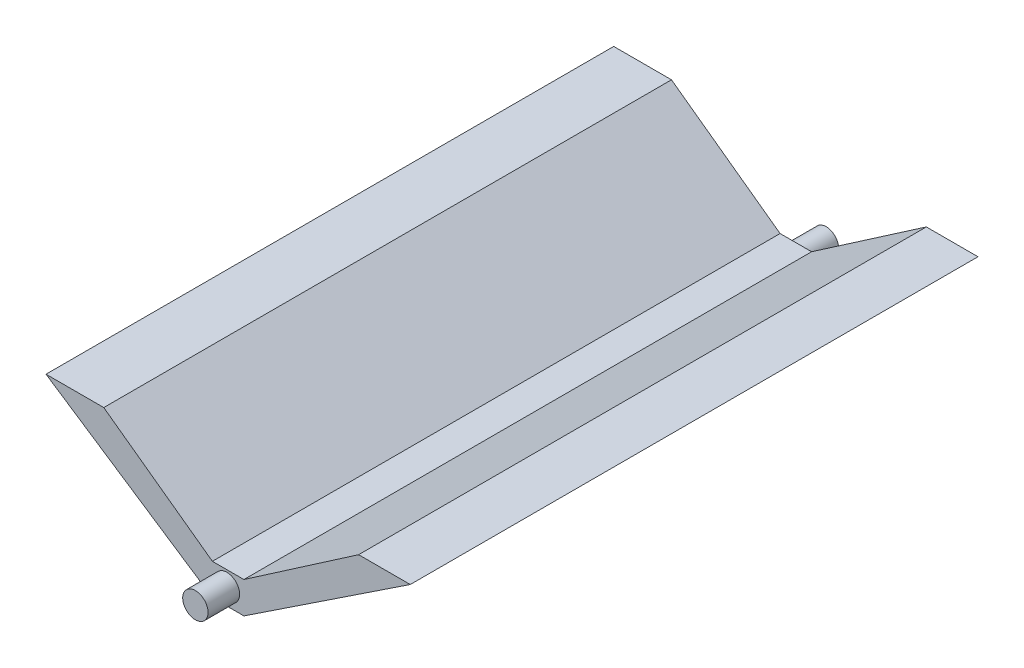
ISO-10303-21;
HEADER;
FILE_DESCRIPTION(('STEP AP214'),'2;1');
FILE_NAME('part.step','',(''),(''),'','','');
FILE_SCHEMA(('AUTOMOTIVE_DESIGN { 1 0 10303 214 1 1 1 1 }'));
ENDSEC;
DATA;
#1=APPLICATION_CONTEXT('core data for automotive mechanical design processes');
#2=APPLICATION_PROTOCOL_DEFINITION('international standard','automotive_design',2000,#1);
#3=PRODUCT_CONTEXT('',#1,'mechanical');
#4=PRODUCT('Part','Part','',(#3));
#5=PRODUCT_RELATED_PRODUCT_CATEGORY('part','',(#4));
#6=PRODUCT_DEFINITION_FORMATION('','',#4);
#7=PRODUCT_DEFINITION_CONTEXT('part definition',#1,'design');
#8=PRODUCT_DEFINITION('design','',#6,#7);
#9=PRODUCT_DEFINITION_SHAPE('','',#8);
#10=(LENGTH_UNIT() NAMED_UNIT(*) SI_UNIT(.MILLI.,.METRE.));
#11=(NAMED_UNIT(*) PLANE_ANGLE_UNIT() SI_UNIT($,.RADIAN.));
#12=(NAMED_UNIT(*) SI_UNIT($,.STERADIAN.) SOLID_ANGLE_UNIT());
#13=UNCERTAINTY_MEASURE_WITH_UNIT(LENGTH_MEASURE(1.E-05),#10,'distance_accuracy_value','');
#14=(GEOMETRIC_REPRESENTATION_CONTEXT(3) GLOBAL_UNCERTAINTY_ASSIGNED_CONTEXT((#13)) GLOBAL_UNIT_ASSIGNED_CONTEXT((#10,
#11,#12)) REPRESENTATION_CONTEXT('',''));
#15=CARTESIAN_POINT('',(0.,0.,0.));
#16=DIRECTION('',(0.,0.,1.));
#17=DIRECTION('',(1.,0.,0.));
#18=AXIS2_PLACEMENT_3D('',#15,#16,#17);
#19=CARTESIAN_POINT('',(115.5,32.5935990338164,360.));
#20=DIRECTION('',(0.,-1.,0.));
#21=DIRECTION('',(0.,0.,-1.));
#22=AXIS2_PLACEMENT_3D('',#19,#20,#21);
#23=PLANE('',#22);
#24=DIRECTION('',(-1.,0.,0.));
#25=VECTOR('',#24,1.);
#26=CARTESIAN_POINT('',(115.5,32.5935990338164,360.));
#27=LINE('',#26,#25);
#28=CARTESIAN_POINT('',(-78.8670896562479,32.5935990338164,360.));
#29=VERTEX_POINT('',#28);
#30=CARTESIAN_POINT('',(-115.5,32.5935990338164,360.));
#31=VERTEX_POINT('',#30);
#32=EDGE_CURVE('E88',#29,#31,#27,.T.);
#33=ORIENTED_EDGE('',*,*,#32,.F.);
#34=DIRECTION('',(0.,0.,1.));
#35=VECTOR('',#34,1.);
#36=CARTESIAN_POINT('',(-78.8670896562479,32.5935990338164,0.));
#37=LINE('',#36,#35);
#38=CARTESIAN_POINT('',(-78.8670896562479,32.5935990338164,0.));
#39=VERTEX_POINT('',#38);
#40=EDGE_CURVE('E143',#39,#29,#37,.T.);
#41=ORIENTED_EDGE('',*,*,#40,.F.);
#42=DIRECTION('',(-1.,0.,0.));
#43=VECTOR('',#42,1.);
#44=CARTESIAN_POINT('',(115.5,32.5935990338164,0.));
#45=LINE('',#44,#43);
#46=CARTESIAN_POINT('',(-115.5,32.5935990338164,0.));
#47=VERTEX_POINT('',#46);
#48=EDGE_CURVE('E130',#39,#47,#45,.T.);
#49=ORIENTED_EDGE('',*,*,#48,.T.);
#50=DIRECTION('',(0.,0.,-1.));
#51=VECTOR('',#50,1.);
#52=CARTESIAN_POINT('',(-115.5,32.5935990338164,360.));
#53=LINE('',#52,#51);
#54=EDGE_CURVE('E44',#31,#47,#53,.T.);
#55=ORIENTED_EDGE('',*,*,#54,.F.);
#56=EDGE_LOOP('',(#33,#41,#49,#55));
#57=FACE_BOUND('',#56,.T.);
#58=ADVANCED_FACE('F36',(#57),#23,.F.);
#59=CARTESIAN_POINT('',(115.5,32.5935990338164,0.));
#60=VERTEX_POINT('',#59);
#61=CARTESIAN_POINT('',(82.7331234629267,32.5935990338164,0.));
#62=VERTEX_POINT('',#61);
#63=EDGE_CURVE('E157',#60,#62,#45,.T.);
#64=ORIENTED_EDGE('',*,*,#63,.T.);
#65=DIRECTION('',(0.,0.,1.));
#66=VECTOR('',#65,1.);
#67=CARTESIAN_POINT('',(82.7331234629267,32.5935990338164,0.));
#68=LINE('',#67,#66);
#69=CARTESIAN_POINT('',(82.7331234629267,32.5935990338164,360.));
#70=VERTEX_POINT('',#69);
#71=EDGE_CURVE('E145',#62,#70,#68,.T.);
#72=ORIENTED_EDGE('',*,*,#71,.T.);
#73=CARTESIAN_POINT('',(115.5,32.5935990338164,360.));
#74=VERTEX_POINT('',#73);
#75=EDGE_CURVE('E149',#74,#70,#27,.T.);
#76=ORIENTED_EDGE('',*,*,#75,.F.);
#77=DIRECTION('',(0.,0.,-1.));
#78=VECTOR('',#77,1.);
#79=CARTESIAN_POINT('',(115.5,32.5935990338164,360.));
#80=LINE('',#79,#78);
#81=EDGE_CURVE('E156',#74,#60,#80,.T.);
#82=ORIENTED_EDGE('',*,*,#81,.T.);
#83=EDGE_LOOP('',(#64,#72,#76,#82));
#84=FACE_BOUND('',#83,.T.);
#85=ADVANCED_FACE('F38',(#84),#23,.F.);
#86=CARTESIAN_POINT('',(-115.5,32.5935990338164,360.));
#87=DIRECTION('',(0.552876196546105,0.833263410508773,0.));
#88=DIRECTION('',(-0.833263410508773,0.552876196546106,0.));
#89=AXIS2_PLACEMENT_3D('',#86,#87,#88);
#90=PLANE('',#89);
#91=DIRECTION('',(0.833263410508773,-0.552876196546106,0.));
#92=VECTOR('',#91,1.);
#93=CARTESIAN_POINT('',(-115.5,32.5935990338164,0.));
#94=LINE('',#93,#92);
#95=CARTESIAN_POINT('',(-10.,-37.4064009661836,0.));
#96=VERTEX_POINT('',#95);
#97=EDGE_CURVE('E160',#47,#96,#94,.T.);
#98=ORIENTED_EDGE('',*,*,#97,.T.);
#99=DIRECTION('',(0.,0.,-1.));
#100=VECTOR('',#99,1.);
#101=CARTESIAN_POINT('',(-10.,-37.4064009661836,360.));
#102=LINE('',#101,#100);
#103=CARTESIAN_POINT('',(-10.,-37.4064009661836,360.));
#104=VERTEX_POINT('',#103);
#105=EDGE_CURVE('E168',#104,#96,#102,.T.);
#106=ORIENTED_EDGE('',*,*,#105,.F.);
#107=DIRECTION('',(0.833263410508773,-0.552876196546106,0.));
#108=VECTOR('',#107,1.);
#109=CARTESIAN_POINT('',(-115.5,32.5935990338164,360.));
#110=LINE('',#109,#108);
#111=EDGE_CURVE('E151',#31,#104,#110,.T.);
#112=ORIENTED_EDGE('',*,*,#111,.F.);
#113=ORIENTED_EDGE('',*,*,#54,.T.);
#114=EDGE_LOOP('',(#98,#106,#112,#113));
#115=FACE_BOUND('',#114,.T.);
#116=ADVANCED_FACE('F173',(#115),#90,.F.);
#117=CARTESIAN_POINT('',(10.,-37.4064009661836,360.));
#118=DIRECTION('',(0.,1.,0.));
#119=DIRECTION('',(0.,0.,1.));
#120=AXIS2_PLACEMENT_3D('',#117,#118,#119);
#121=PLANE('',#120);
#122=DIRECTION('',(1.,0.,0.));
#123=VECTOR('',#122,1.);
#124=CARTESIAN_POINT('',(10.,-37.4064009661836,0.));
#125=LINE('',#124,#123);
#126=CARTESIAN_POINT('',(10.,-37.4064009661836,0.));
#127=VERTEX_POINT('',#126);
#128=EDGE_CURVE('E162',#96,#127,#125,.T.);
#129=ORIENTED_EDGE('',*,*,#128,.T.);
#130=DIRECTION('',(0.,0.,-1.));
#131=VECTOR('',#130,1.);
#132=CARTESIAN_POINT('',(10.,-37.4064009661836,360.));
#133=LINE('',#132,#131);
#134=CARTESIAN_POINT('',(10.,-37.4064009661836,360.));
#135=VERTEX_POINT('',#134);
#136=EDGE_CURVE('E166',#135,#127,#133,.T.);
#137=ORIENTED_EDGE('',*,*,#136,.F.);
#138=DIRECTION('',(1.,0.,0.));
#139=VECTOR('',#138,1.);
#140=CARTESIAN_POINT('',(10.,-37.4064009661836,360.));
#141=LINE('',#140,#139);
#142=EDGE_CURVE('E153',#104,#135,#141,.T.);
#143=ORIENTED_EDGE('',*,*,#142,.F.);
#144=ORIENTED_EDGE('',*,*,#105,.T.);
#145=EDGE_LOOP('',(#129,#137,#143,#144));
#146=FACE_BOUND('',#145,.T.);
#147=ADVANCED_FACE('F180',(#146),#121,.F.);
#148=CARTESIAN_POINT('',(10.,-37.4064009661836,360.));
#149=DIRECTION('',(-0.552876196546105,0.833263410508773,0.));
#150=DIRECTION('',(-0.833263410508773,-0.552876196546106,0.));
#151=AXIS2_PLACEMENT_3D('',#148,#149,#150);
#152=PLANE('',#151);
#153=DIRECTION('',(0.833263410508773,0.552876196546106,0.));
#154=VECTOR('',#153,1.);
#155=CARTESIAN_POINT('',(10.,-37.4064009661836,0.));
#156=LINE('',#155,#154);
#157=EDGE_CURVE('E81',#127,#60,#156,.T.);
#158=ORIENTED_EDGE('',*,*,#157,.T.);
#159=ORIENTED_EDGE('',*,*,#81,.F.);
#160=DIRECTION('',(0.833263410508773,0.552876196546106,0.));
#161=VECTOR('',#160,1.);
#162=CARTESIAN_POINT('',(10.,-37.4064009661836,360.));
#163=LINE('',#162,#161);
#164=EDGE_CURVE('E60',#135,#74,#163,.T.);
#165=ORIENTED_EDGE('',*,*,#164,.F.);
#166=ORIENTED_EDGE('',*,*,#136,.T.);
#167=EDGE_LOOP('',(#158,#159,#165,#166));
#168=FACE_BOUND('',#167,.T.);
#169=ADVANCED_FACE('F182',(#168),#152,.F.);
#170=CARTESIAN_POINT('',(0.,0.,360.));
#171=DIRECTION('',(0.,0.,1.));
#172=DIRECTION('',(1.,0.,0.));
#173=AXIS2_PLACEMENT_3D('',#170,#171,#172);
#174=PLANE('',#173);
#175=CARTESIAN_POINT('',(-0.773206761335771,-26.8912817418148,360.));
#176=DIRECTION('',(0.,0.,1.));
#177=DIRECTION('',(1.,0.,0.));
#178=AXIS2_PLACEMENT_3D('',#175,#176,#177);
#179=CIRCLE('',#178,8.05);
#180=CARTESIAN_POINT('',(7.27679323866423,-26.8912817418148,360.));
#181=VERTEX_POINT('',#180);
#182=EDGE_CURVE('E136',#181,#181,#179,.T.);
#183=ORIENTED_EDGE('',*,*,#182,.F.);
#184=EDGE_LOOP('',(#183));
#185=FACE_BOUND('',#184,.T.);
#186=DIRECTION('',(0.809211786942428,-0.587517049857655,0.));
#187=VECTOR('',#186,1.);
#188=CARTESIAN_POINT('',(-10.,-17.4064009661836,360.));
#189=LINE('',#188,#187);
#190=CARTESIAN_POINT('',(-10.,-17.4064009661836,360.));
#191=VERTEX_POINT('',#190);
#192=EDGE_CURVE('E116',#29,#191,#189,.T.);
#193=ORIENTED_EDGE('',*,*,#192,.F.);
#194=ORIENTED_EDGE('',*,*,#32,.T.);
#195=ORIENTED_EDGE('',*,*,#111,.T.);
#196=ORIENTED_EDGE('',*,*,#142,.T.);
#197=ORIENTED_EDGE('',*,*,#164,.T.);
#198=ORIENTED_EDGE('',*,*,#75,.T.);
#199=DIRECTION('',(0.824063199265385,0.566497876091781,0.));
#200=VECTOR('',#199,1.);
#201=CARTESIAN_POINT('',(10.,-17.4064009661836,360.));
#202=LINE('',#201,#200);
#203=CARTESIAN_POINT('',(10.,-17.4064009661836,360.));
#204=VERTEX_POINT('',#203);
#205=EDGE_CURVE('E131',#204,#70,#202,.T.);
#206=ORIENTED_EDGE('',*,*,#205,.F.);
#207=DIRECTION('',(1.,0.,0.));
#208=VECTOR('',#207,1.);
#209=CARTESIAN_POINT('',(-10.,-17.4064009661836,360.));
#210=LINE('',#209,#208);
#211=EDGE_CURVE('E133',#191,#204,#210,.T.);
#212=ORIENTED_EDGE('',*,*,#211,.F.);
#213=EDGE_LOOP('',(#193,#194,#195,#196,#197,#198,#206,#212));
#214=FACE_BOUND('',#213,.T.);
#215=ADVANCED_FACE('F186',(#185,#214),#174,.T.);
#216=CARTESIAN_POINT('',(0.,0.,0.));
#217=DIRECTION('',(0.,0.,1.));
#218=DIRECTION('',(1.,0.,0.));
#219=AXIS2_PLACEMENT_3D('',#216,#217,#218);
#220=PLANE('',#219);
#221=CARTESIAN_POINT('',(-0.773206761335771,-26.8912817418148,0.));
#222=DIRECTION('',(0.,0.,1.));
#223=DIRECTION('',(1.,0.,0.));
#224=AXIS2_PLACEMENT_3D('',#221,#222,#223);
#225=CIRCLE('',#224,7.87377693535657);
#226=CARTESIAN_POINT('',(7.10057017402079,-26.8912817418148,0.));
#227=VERTEX_POINT('',#226);
#228=EDGE_CURVE('E11',#227,#227,#225,.F.);
#229=ORIENTED_EDGE('',*,*,#228,.F.);
#230=EDGE_LOOP('',(#229));
#231=FACE_BOUND('',#230,.T.);
#232=ORIENTED_EDGE('',*,*,#48,.F.);
#233=DIRECTION('',(0.809211786942428,-0.587517049857655,0.));
#234=VECTOR('',#233,1.);
#235=CARTESIAN_POINT('',(-10.,-17.4064009661836,0.));
#236=LINE('',#235,#234);
#237=CARTESIAN_POINT('',(-10.,-17.4064009661836,0.));
#238=VERTEX_POINT('',#237);
#239=EDGE_CURVE('E114',#39,#238,#236,.T.);
#240=ORIENTED_EDGE('',*,*,#239,.T.);
#241=DIRECTION('',(1.,0.,0.));
#242=VECTOR('',#241,1.);
#243=CARTESIAN_POINT('',(-10.,-17.4064009661836,0.));
#244=LINE('',#243,#242);
#245=CARTESIAN_POINT('',(10.,-17.4064009661836,0.));
#246=VERTEX_POINT('',#245);
#247=EDGE_CURVE('E123',#238,#246,#244,.T.);
#248=ORIENTED_EDGE('',*,*,#247,.T.);
#249=DIRECTION('',(0.824063199265385,0.566497876091781,0.));
#250=VECTOR('',#249,1.);
#251=CARTESIAN_POINT('',(10.,-17.4064009661836,0.));
#252=LINE('',#251,#250);
#253=EDGE_CURVE('E51',#246,#62,#252,.T.);
#254=ORIENTED_EDGE('',*,*,#253,.T.);
#255=ORIENTED_EDGE('',*,*,#63,.F.);
#256=ORIENTED_EDGE('',*,*,#157,.F.);
#257=ORIENTED_EDGE('',*,*,#128,.F.);
#258=ORIENTED_EDGE('',*,*,#97,.F.);
#259=EDGE_LOOP('',(#232,#240,#248,#254,#255,#256,#257,#258));
#260=FACE_BOUND('',#259,.T.);
#261=ADVANCED_FACE('F128',(#231,#260),#220,.F.);
#262=CARTESIAN_POINT('',(-10.,-17.4064009661836,0.));
#263=DIRECTION('',(-0.587517049857655,-0.809211786942428,0.));
#264=DIRECTION('',(0.809211786942428,-0.587517049857655,0.));
#265=AXIS2_PLACEMENT_3D('',#262,#263,#264);
#266=PLANE('',#265);
#267=ORIENTED_EDGE('',*,*,#192,.T.);
#268=DIRECTION('',(0.,0.,1.));
#269=VECTOR('',#268,1.);
#270=CARTESIAN_POINT('',(-10.,-17.4064009661836,0.));
#271=LINE('',#270,#269);
#272=EDGE_CURVE('E110',#238,#191,#271,.T.);
#273=ORIENTED_EDGE('',*,*,#272,.F.);
#274=ORIENTED_EDGE('',*,*,#239,.F.);
#275=ORIENTED_EDGE('',*,*,#40,.T.);
#276=EDGE_LOOP('',(#267,#273,#274,#275));
#277=FACE_BOUND('',#276,.T.);
#278=ADVANCED_FACE('F112',(#277),#266,.F.);
#279=CARTESIAN_POINT('',(10.,-17.4064009661836,0.));
#280=DIRECTION('',(0.566497876091781,-0.824063199265385,0.));
#281=DIRECTION('',(0.824063199265385,0.566497876091781,0.));
#282=AXIS2_PLACEMENT_3D('',#279,#280,#281);
#283=PLANE('',#282);
#284=ORIENTED_EDGE('',*,*,#205,.T.);
#285=ORIENTED_EDGE('',*,*,#71,.F.);
#286=ORIENTED_EDGE('',*,*,#253,.F.);
#287=DIRECTION('',(0.,0.,1.));
#288=VECTOR('',#287,1.);
#289=CARTESIAN_POINT('',(10.,-17.4064009661836,0.));
#290=LINE('',#289,#288);
#291=EDGE_CURVE('E120',#246,#204,#290,.T.);
#292=ORIENTED_EDGE('',*,*,#291,.T.);
#293=EDGE_LOOP('',(#284,#285,#286,#292));
#294=FACE_BOUND('',#293,.T.);
#295=ADVANCED_FACE('F187',(#294),#283,.F.);
#296=CARTESIAN_POINT('',(-10.,-17.4064009661836,0.));
#297=DIRECTION('',(0.,-1.,0.));
#298=DIRECTION('',(0.,0.,-1.));
#299=AXIS2_PLACEMENT_3D('',#296,#297,#298);
#300=PLANE('',#299);
#301=ORIENTED_EDGE('',*,*,#211,.T.);
#302=ORIENTED_EDGE('',*,*,#291,.F.);
#303=ORIENTED_EDGE('',*,*,#247,.F.);
#304=ORIENTED_EDGE('',*,*,#272,.T.);
#305=EDGE_LOOP('',(#301,#302,#303,#304));
#306=FACE_BOUND('',#305,.T.);
#307=ADVANCED_FACE('F124',(#306),#300,.F.);
#308=CARTESIAN_POINT('',(-0.773206761335771,-26.8912817418148,380.));
#309=DIRECTION('',(0.,0.,-1.));
#310=DIRECTION('',(-1.,0.,0.));
#311=AXIS2_PLACEMENT_3D('',#308,#309,#310);
#312=CYLINDRICAL_SURFACE('',#311,8.05);
#313=CARTESIAN_POINT('',(-0.773206761335771,-26.8912817418148,380.));
#314=DIRECTION('',(0.,0.,1.));
#315=DIRECTION('',(1.,0.,0.));
#316=AXIS2_PLACEMENT_3D('',#313,#314,#315);
#317=CIRCLE('',#316,8.05);
#318=CARTESIAN_POINT('',(7.27679323866423,-26.8912817418148,380.));
#319=VERTEX_POINT('',#318);
#320=EDGE_CURVE('E141',#319,#319,#317,.T.);
#321=ORIENTED_EDGE('',*,*,#320,.F.);
#322=EDGE_LOOP('',(#321));
#323=FACE_BOUND('',#322,.T.);
#324=ORIENTED_EDGE('',*,*,#182,.T.);
#325=EDGE_LOOP('',(#324));
#326=FACE_BOUND('',#325,.T.);
#327=ADVANCED_FACE('F194',(#323,#326),#312,.T.);
#328=CARTESIAN_POINT('',(-0.773206761335771,-26.8912817418148,380.));
#329=DIRECTION('',(0.,0.,1.));
#330=DIRECTION('',(1.,0.,0.));
#331=AXIS2_PLACEMENT_3D('',#328,#329,#330);
#332=PLANE('',#331);
#333=ORIENTED_EDGE('',*,*,#320,.T.);
#334=EDGE_LOOP('',(#333));
#335=FACE_BOUND('',#334,.T.);
#336=ADVANCED_FACE('F233',(#335),#332,.T.);
#337=CARTESIAN_POINT('',(-0.773206761335771,-26.8912817418148,-20.));
#338=DIRECTION('',(0.,0.,1.));
#339=DIRECTION('',(1.,0.,0.));
#340=AXIS2_PLACEMENT_3D('',#337,#338,#339);
#341=CYLINDRICAL_SURFACE('',#340,7.87377693535657);
#342=CARTESIAN_POINT('',(-0.773206761335771,-26.8912817418148,-20.));
#343=DIRECTION('',(0.,0.,-1.));
#344=DIRECTION('',(-1.,0.,0.));
#345=AXIS2_PLACEMENT_3D('',#342,#343,#344);
#346=CIRCLE('',#345,7.87377693535657);
#347=CARTESIAN_POINT('',(-8.64698369669234,-26.8912817418148,-20.));
#348=VERTEX_POINT('',#347);
#349=EDGE_CURVE('E222',#348,#348,#346,.T.);
#350=ORIENTED_EDGE('',*,*,#349,.F.);
#351=EDGE_LOOP('',(#350));
#352=FACE_BOUND('',#351,.T.);
#353=ORIENTED_EDGE('',*,*,#228,.T.);
#354=EDGE_LOOP('',(#353));
#355=FACE_BOUND('',#354,.T.);
#356=ADVANCED_FACE('F230',(#352,#355),#341,.T.);
#357=CARTESIAN_POINT('',(-0.773206761335771,-26.8912817418148,-20.));
#358=DIRECTION('',(0.,0.,-1.));
#359=DIRECTION('',(-1.,0.,0.));
#360=AXIS2_PLACEMENT_3D('',#357,#358,#359);
#361=PLANE('',#360);
#362=ORIENTED_EDGE('',*,*,#349,.T.);
#363=EDGE_LOOP('',(#362));
#364=FACE_BOUND('',#363,.T.);
#365=ADVANCED_FACE('F228',(#364),#361,.T.);
#366=CLOSED_SHELL('',(#58,#85,#116,#147,#169,#215,#261,#278,#295,#307,#327,#336,#356,#365));
#367=MANIFOLD_SOLID_BREP('B2',#366);
#368=ADVANCED_BREP_SHAPE_REPRESENTATION('',(#18,#367),#14);
#369=SHAPE_DEFINITION_REPRESENTATION(#9,#368);
ENDSEC;
END-ISO-10303-21;
